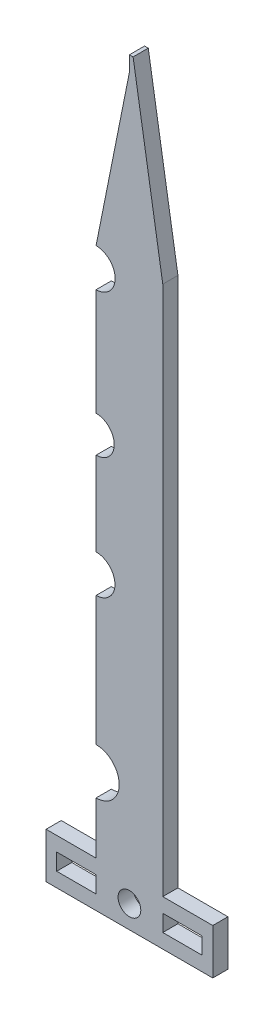
ISO-10303-21;
HEADER;
FILE_DESCRIPTION(('STEP AP214'),'2;1');
FILE_NAME('part.step','',(''),(''),'','','');
FILE_SCHEMA(('AUTOMOTIVE_DESIGN { 1 0 10303 214 1 1 1 1 }'));
ENDSEC;
DATA;
#1=APPLICATION_CONTEXT('core data for automotive mechanical design processes');
#2=APPLICATION_PROTOCOL_DEFINITION('international standard','automotive_design',2000,#1);
#3=PRODUCT_CONTEXT('',#1,'mechanical');
#4=PRODUCT('Part','Part','',(#3));
#5=PRODUCT_RELATED_PRODUCT_CATEGORY('part','',(#4));
#6=PRODUCT_DEFINITION_FORMATION('','',#4);
#7=PRODUCT_DEFINITION_CONTEXT('part definition',#1,'design');
#8=PRODUCT_DEFINITION('design','',#6,#7);
#9=PRODUCT_DEFINITION_SHAPE('','',#8);
#10=(LENGTH_UNIT() NAMED_UNIT(*) SI_UNIT(.MILLI.,.METRE.));
#11=(NAMED_UNIT(*) PLANE_ANGLE_UNIT() SI_UNIT($,.RADIAN.));
#12=(NAMED_UNIT(*) SI_UNIT($,.STERADIAN.) SOLID_ANGLE_UNIT());
#13=UNCERTAINTY_MEASURE_WITH_UNIT(LENGTH_MEASURE(1.E-05),#10,'distance_accuracy_value','');
#14=(GEOMETRIC_REPRESENTATION_CONTEXT(3) GLOBAL_UNCERTAINTY_ASSIGNED_CONTEXT((#13)) GLOBAL_UNIT_ASSIGNED_CONTEXT((#10,
#11,#12)) REPRESENTATION_CONTEXT('',''));
#15=CARTESIAN_POINT('',(0.,0.,0.));
#16=DIRECTION('',(0.,0.,1.));
#17=DIRECTION('',(1.,0.,0.));
#18=AXIS2_PLACEMENT_3D('',#15,#16,#17);
#19=CARTESIAN_POINT('',(-4.39999999998468,12.9314476149887,2.));
#20=DIRECTION('',(0.,0.,-1.));
#21=DIRECTION('',(-1.,0.,0.));
#22=AXIS2_PLACEMENT_3D('',#19,#20,#21);
#23=PLANE('',#22);
#24=DIRECTION('',(0.,-1.,0.));
#25=VECTOR('',#24,1.);
#26=CARTESIAN_POINT('',(4.4,1.1,2.));
#27=LINE('',#26,#25);
#28=CARTESIAN_POINT('',(4.4,1.1,2.));
#29=VERTEX_POINT('',#28);
#30=CARTESIAN_POINT('',(4.4,-1.1,2.));
#31=VERTEX_POINT('',#30);
#32=EDGE_CURVE('E244',#29,#31,#27,.T.);
#33=ORIENTED_EDGE('',*,*,#32,.F.);
#34=DIRECTION('',(-1.,0.,0.));
#35=VECTOR('',#34,1.);
#36=CARTESIAN_POINT('',(9.6,1.1,2.));
#37=LINE('',#36,#35);
#38=CARTESIAN_POINT('',(9.6,1.1,2.));
#39=VERTEX_POINT('',#38);
#40=EDGE_CURVE('E252',#39,#29,#37,.T.);
#41=ORIENTED_EDGE('',*,*,#40,.F.);
#42=DIRECTION('',(0.,1.,0.));
#43=VECTOR('',#42,1.);
#44=CARTESIAN_POINT('',(9.6,1.1,2.));
#45=LINE('',#44,#43);
#46=CARTESIAN_POINT('',(9.6,-1.1,2.));
#47=VERTEX_POINT('',#46);
#48=EDGE_CURVE('E249',#47,#39,#45,.T.);
#49=ORIENTED_EDGE('',*,*,#48,.F.);
#50=DIRECTION('',(1.,0.,0.));
#51=VECTOR('',#50,1.);
#52=CARTESIAN_POINT('',(9.6,-1.1,2.));
#53=LINE('',#52,#51);
#54=EDGE_CURVE('E246',#31,#47,#53,.T.);
#55=ORIENTED_EDGE('',*,*,#54,.F.);
#56=EDGE_LOOP('',(#33,#41,#49,#55));
#57=FACE_BOUND('',#56,.T.);
#58=DIRECTION('',(0.,1.,0.));
#59=VECTOR('',#58,1.);
#60=CARTESIAN_POINT('',(11.,3.,2.));
#61=LINE('',#60,#59);
#62=CARTESIAN_POINT('',(11.,-3.,2.));
#63=VERTEX_POINT('',#62);
#64=CARTESIAN_POINT('',(11.,3.,2.));
#65=VERTEX_POINT('',#64);
#66=EDGE_CURVE('E281',#63,#65,#61,.T.);
#67=ORIENTED_EDGE('',*,*,#66,.T.);
#68=DIRECTION('',(-1.,0.,0.));
#69=VECTOR('',#68,1.);
#70=CARTESIAN_POINT('',(4.4,3.,2.));
#71=LINE('',#70,#69);
#72=CARTESIAN_POINT('',(4.4,3.,2.));
#73=VERTEX_POINT('',#72);
#74=EDGE_CURVE('E284',#65,#73,#71,.T.);
#75=ORIENTED_EDGE('',*,*,#74,.T.);
#76=DIRECTION('',(0.,1.,0.));
#77=VECTOR('',#76,1.);
#78=CARTESIAN_POINT('',(4.39999999999998,72.9999999999821,2.));
#79=LINE('',#78,#77);
#80=CARTESIAN_POINT('',(4.39999999999998,72.9999999999821,2.));
#81=VERTEX_POINT('',#80);
#82=EDGE_CURVE('E287',#73,#81,#79,.T.);
#83=ORIENTED_EDGE('',*,*,#82,.T.);
#84=DIRECTION('',(-0.160841232854265,0.986980292515469,0.));
#85=VECTOR('',#84,1.);
#86=CARTESIAN_POINT('',(0.486767158779976,97.0130197074845,2.));
#87=LINE('',#86,#85);
#88=CARTESIAN_POINT('',(0.486767158779976,97.0130197074845,2.));
#89=VERTEX_POINT('',#88);
#90=EDGE_CURVE('E289',#81,#89,#87,.T.);
#91=ORIENTED_EDGE('',*,*,#90,.T.);
#92=DIRECTION('',(-1.,0.,0.));
#93=VECTOR('',#92,1.);
#94=CARTESIAN_POINT('',(0.,97.0130197074845,2.));
#95=LINE('',#94,#93);
#96=CARTESIAN_POINT('',(0.,97.0130197074845,2.));
#97=VERTEX_POINT('',#96);
#98=EDGE_CURVE('E291',#89,#97,#95,.T.);
#99=ORIENTED_EDGE('',*,*,#98,.T.);
#100=DIRECTION('',(0.,-1.,0.));
#101=VECTOR('',#100,1.);
#102=CARTESIAN_POINT('',(0.,97.0130197074845,2.));
#103=LINE('',#102,#101);
#104=CARTESIAN_POINT('',(0.,95.0130197074845,2.));
#105=VERTEX_POINT('',#104);
#106=EDGE_CURVE('E293',#97,#105,#103,.T.);
#107=ORIENTED_EDGE('',*,*,#106,.T.);
#108=DIRECTION('',(-0.19600459879337,-0.980602976362937,0.));
#109=VECTOR('',#108,1.);
#110=CARTESIAN_POINT('',(0.,95.0130197074845,2.));
#111=LINE('',#110,#109);
#112=CARTESIAN_POINT('',(-4.39999999999915,72.9999999999999,2.));
#113=VERTEX_POINT('',#112);
#114=EDGE_CURVE('E295',#105,#113,#111,.T.);
#115=ORIENTED_EDGE('',*,*,#114,.T.);
#116=CARTESIAN_POINT('',(-4.40000000000089,70.4831653604391,2.));
#117=DIRECTION('',(0.,0.,-1.));
#118=DIRECTION('',(-1.,0.,0.));
#119=AXIS2_PLACEMENT_3D('',#116,#117,#118);
#120=CIRCLE('',#119,2.51683463956072);
#121=CARTESIAN_POINT('',(-4.39999999999921,67.9663307208784,2.));
#122=VERTEX_POINT('',#121);
#123=EDGE_CURVE('E297',#113,#122,#120,.T.);
#124=ORIENTED_EDGE('',*,*,#123,.T.);
#125=DIRECTION('',(0.,-1.,0.));
#126=VECTOR('',#125,1.);
#127=CARTESIAN_POINT('',(-4.39999999999938,53.8485939816553,2.));
#128=LINE('',#127,#126);
#129=CARTESIAN_POINT('',(-4.39999999999938,53.8485939816553,2.));
#130=VERTEX_POINT('',#129);
#131=EDGE_CURVE('E299',#122,#130,#128,.T.);
#132=ORIENTED_EDGE('',*,*,#131,.T.);
#133=CARTESIAN_POINT('',(-4.39999999999942,51.4512477461011,2.));
#134=DIRECTION('',(0.,0.,-1.));
#135=DIRECTION('',(-1.,0.,0.));
#136=AXIS2_PLACEMENT_3D('',#133,#134,#135);
#137=CIRCLE('',#136,2.39734623555421);
#138=CARTESIAN_POINT('',(-4.39999999999944,49.0539015105469,2.));
#139=VERTEX_POINT('',#138);
#140=EDGE_CURVE('E301',#130,#139,#137,.T.);
#141=ORIENTED_EDGE('',*,*,#140,.T.);
#142=DIRECTION('',(0.,-1.,0.));
#143=VECTOR('',#142,1.);
#144=CARTESIAN_POINT('',(-4.39999999999958,37.9999999999999,2.));
#145=LINE('',#144,#143);
#146=CARTESIAN_POINT('',(-4.39999999999958,37.9999999999999,2.));
#147=VERTEX_POINT('',#146);
#148=EDGE_CURVE('E303',#139,#147,#145,.T.);
#149=ORIENTED_EDGE('',*,*,#148,.T.);
#150=CARTESIAN_POINT('',(-4.39999999999961,35.5129822568133,2.));
#151=DIRECTION('',(0.,0.,-1.));
#152=DIRECTION('',(-1.,0.,0.));
#153=AXIS2_PLACEMENT_3D('',#150,#151,#152);
#154=CIRCLE('',#153,2.48701774318666);
#155=CARTESIAN_POINT('',(-4.39999999999964,33.0259645136266,2.));
#156=VERTEX_POINT('',#155);
#157=EDGE_CURVE('E305',#147,#156,#154,.T.);
#158=ORIENTED_EDGE('',*,*,#157,.T.);
#159=DIRECTION('',(0.,-1.,0.));
#160=VECTOR('',#159,1.);
#161=CARTESIAN_POINT('',(-4.39999999999984,15.9828895361329,2.));
#162=LINE('',#161,#160);
#163=CARTESIAN_POINT('',(-4.39999999999984,15.9828895361329,2.));
#164=VERTEX_POINT('',#163);
#165=EDGE_CURVE('E307',#156,#164,#162,.T.);
#166=ORIENTED_EDGE('',*,*,#165,.T.);
#167=CARTESIAN_POINT('',(-4.39999999998468,12.9314476149887,2.));
#168=DIRECTION('',(0.,0.,-1.));
#169=DIRECTION('',(-1.,0.,0.));
#170=AXIS2_PLACEMENT_3D('',#167,#168,#169);
#171=CIRCLE('',#170,3.05144192114426);
#172=CARTESIAN_POINT('',(-4.39999999999992,9.8800056938444,2.));
#173=VERTEX_POINT('',#172);
#174=EDGE_CURVE('E309',#164,#173,#171,.T.);
#175=ORIENTED_EDGE('',*,*,#174,.T.);
#176=DIRECTION('',(0.,-1.,0.));
#177=VECTOR('',#176,1.);
#178=CARTESIAN_POINT('',(-4.4,3.,2.));
#179=LINE('',#178,#177);
#180=CARTESIAN_POINT('',(-4.4,3.,2.));
#181=VERTEX_POINT('',#180);
#182=EDGE_CURVE('E311',#173,#181,#179,.T.);
#183=ORIENTED_EDGE('',*,*,#182,.T.);
#184=DIRECTION('',(-1.,0.,0.));
#185=VECTOR('',#184,1.);
#186=CARTESIAN_POINT('',(-11.,3.,2.));
#187=LINE('',#186,#185);
#188=CARTESIAN_POINT('',(-11.,3.,2.));
#189=VERTEX_POINT('',#188);
#190=EDGE_CURVE('E313',#181,#189,#187,.T.);
#191=ORIENTED_EDGE('',*,*,#190,.T.);
#192=DIRECTION('',(0.,-1.,0.));
#193=VECTOR('',#192,1.);
#194=CARTESIAN_POINT('',(-11.,0.,2.));
#195=LINE('',#194,#193);
#196=CARTESIAN_POINT('',(-11.,-3.,2.));
#197=VERTEX_POINT('',#196);
#198=EDGE_CURVE('E315',#189,#197,#195,.T.);
#199=ORIENTED_EDGE('',*,*,#198,.T.);
#200=DIRECTION('',(1.,0.,0.));
#201=VECTOR('',#200,1.);
#202=CARTESIAN_POINT('',(-11.,-3.,2.));
#203=LINE('',#202,#201);
#204=EDGE_CURVE('E317',#197,#63,#203,.T.);
#205=ORIENTED_EDGE('',*,*,#204,.T.);
#206=EDGE_LOOP('',(#67,#75,#83,#91,#99,#107,#115,#124,#132,#141,#149,#158,#166,#175,#183,#191,
#199,#205));
#207=FACE_BOUND('',#206,.T.);
#208=CARTESIAN_POINT('',(0.,0.,2.));
#209=DIRECTION('',(0.,0.,1.));
#210=DIRECTION('',(1.,0.,0.));
#211=AXIS2_PLACEMENT_3D('',#208,#209,#210);
#212=CIRCLE('',#211,1.5);
#213=CARTESIAN_POINT('',(1.5,0.,2.));
#214=VERTEX_POINT('',#213);
#215=EDGE_CURVE('E275',#214,#214,#212,.T.);
#216=ORIENTED_EDGE('',*,*,#215,.F.);
#217=EDGE_LOOP('',(#216));
#218=FACE_BOUND('',#217,.T.);
#219=DIRECTION('',(0.,-1.,0.));
#220=VECTOR('',#219,1.);
#221=CARTESIAN_POINT('',(-9.6,1.1,2.));
#222=LINE('',#221,#220);
#223=CARTESIAN_POINT('',(-9.6,1.1,2.));
#224=VERTEX_POINT('',#223);
#225=CARTESIAN_POINT('',(-9.6,-1.1,2.));
#226=VERTEX_POINT('',#225);
#227=EDGE_CURVE('E208',#224,#226,#222,.T.);
#228=ORIENTED_EDGE('',*,*,#227,.F.);
#229=DIRECTION('',(-1.,0.,0.));
#230=VECTOR('',#229,1.);
#231=CARTESIAN_POINT('',(-9.6,1.1,2.));
#232=LINE('',#231,#230);
#233=CARTESIAN_POINT('',(-4.4,1.1,2.));
#234=VERTEX_POINT('',#233);
#235=EDGE_CURVE('E230',#234,#224,#232,.T.);
#236=ORIENTED_EDGE('',*,*,#235,.F.);
#237=DIRECTION('',(0.,1.,0.));
#238=VECTOR('',#237,1.);
#239=CARTESIAN_POINT('',(-4.4,1.1,2.));
#240=LINE('',#239,#238);
#241=CARTESIAN_POINT('',(-4.4,-1.1,2.));
#242=VERTEX_POINT('',#241);
#243=EDGE_CURVE('E228',#242,#234,#240,.T.);
#244=ORIENTED_EDGE('',*,*,#243,.F.);
#245=DIRECTION('',(1.,0.,0.));
#246=VECTOR('',#245,1.);
#247=CARTESIAN_POINT('',(-9.6,-1.1,2.));
#248=LINE('',#247,#246);
#249=EDGE_CURVE('E216',#226,#242,#248,.T.);
#250=ORIENTED_EDGE('',*,*,#249,.F.);
#251=EDGE_LOOP('',(#228,#236,#244,#250));
#252=FACE_BOUND('',#251,.T.);
#253=ADVANCED_FACE('F35',(#57,#207,#218,#252),#23,.F.);
#254=CARTESIAN_POINT('',(-4.39999999998468,12.9314476149887,0.));
#255=DIRECTION('',(0.,0.,-1.));
#256=DIRECTION('',(-1.,0.,0.));
#257=AXIS2_PLACEMENT_3D('',#254,#255,#256);
#258=PLANE('',#257);
#259=DIRECTION('',(-1.,0.,0.));
#260=VECTOR('',#259,1.);
#261=CARTESIAN_POINT('',(4.4,3.,0.));
#262=LINE('',#261,#260);
#263=CARTESIAN_POINT('',(11.,3.,0.));
#264=VERTEX_POINT('',#263);
#265=CARTESIAN_POINT('',(4.4,3.,0.));
#266=VERTEX_POINT('',#265);
#267=EDGE_CURVE('E278',#264,#266,#262,.T.);
#268=ORIENTED_EDGE('',*,*,#267,.F.);
#269=DIRECTION('',(0.,1.,0.));
#270=VECTOR('',#269,1.);
#271=CARTESIAN_POINT('',(11.,0.,0.));
#272=LINE('',#271,#270);
#273=CARTESIAN_POINT('',(11.,-3.,0.));
#274=VERTEX_POINT('',#273);
#275=EDGE_CURVE('E285',#274,#264,#272,.T.);
#276=ORIENTED_EDGE('',*,*,#275,.F.);
#277=DIRECTION('',(1.,0.,0.));
#278=VECTOR('',#277,1.);
#279=CARTESIAN_POINT('',(-11.,-3.,0.));
#280=LINE('',#279,#278);
#281=CARTESIAN_POINT('',(-11.,-3.,0.));
#282=VERTEX_POINT('',#281);
#283=EDGE_CURVE('E353',#282,#274,#280,.T.);
#284=ORIENTED_EDGE('',*,*,#283,.F.);
#285=DIRECTION('',(0.,-1.,0.));
#286=VECTOR('',#285,1.);
#287=CARTESIAN_POINT('',(-11.,0.,0.));
#288=LINE('',#287,#286);
#289=CARTESIAN_POINT('',(-11.,3.,0.));
#290=VERTEX_POINT('',#289);
#291=EDGE_CURVE('E351',#290,#282,#288,.T.);
#292=ORIENTED_EDGE('',*,*,#291,.F.);
#293=DIRECTION('',(-1.,0.,0.));
#294=VECTOR('',#293,1.);
#295=CARTESIAN_POINT('',(-11.,3.,0.));
#296=LINE('',#295,#294);
#297=CARTESIAN_POINT('',(-4.4,3.,0.));
#298=VERTEX_POINT('',#297);
#299=EDGE_CURVE('E348',#298,#290,#296,.T.);
#300=ORIENTED_EDGE('',*,*,#299,.F.);
#301=DIRECTION('',(0.,-1.,0.));
#302=VECTOR('',#301,1.);
#303=CARTESIAN_POINT('',(-4.4,3.,0.));
#304=LINE('',#303,#302);
#305=CARTESIAN_POINT('',(-4.39999999999992,9.8800056938444,0.));
#306=VERTEX_POINT('',#305);
#307=EDGE_CURVE('E346',#306,#298,#304,.T.);
#308=ORIENTED_EDGE('',*,*,#307,.F.);
#309=CARTESIAN_POINT('',(-4.39999999998468,12.9314476149887,0.));
#310=DIRECTION('',(0.,0.,-1.));
#311=DIRECTION('',(-1.,0.,0.));
#312=AXIS2_PLACEMENT_3D('',#309,#310,#311);
#313=CIRCLE('',#312,3.05144192114426);
#314=CARTESIAN_POINT('',(-4.39999999999984,15.9828895361329,0.));
#315=VERTEX_POINT('',#314);
#316=EDGE_CURVE('E344',#315,#306,#313,.T.);
#317=ORIENTED_EDGE('',*,*,#316,.F.);
#318=DIRECTION('',(0.,-1.,0.));
#319=VECTOR('',#318,1.);
#320=CARTESIAN_POINT('',(-4.39999999999984,15.9828895361329,0.));
#321=LINE('',#320,#319);
#322=CARTESIAN_POINT('',(-4.39999999999964,33.0259645136266,0.));
#323=VERTEX_POINT('',#322);
#324=EDGE_CURVE('E342',#323,#315,#321,.T.);
#325=ORIENTED_EDGE('',*,*,#324,.F.);
#326=CARTESIAN_POINT('',(-4.39999999999961,35.5129822568133,0.));
#327=DIRECTION('',(0.,0.,-1.));
#328=DIRECTION('',(-1.,0.,0.));
#329=AXIS2_PLACEMENT_3D('',#326,#327,#328);
#330=CIRCLE('',#329,2.48701774318666);
#331=CARTESIAN_POINT('',(-4.39999999999958,37.9999999999999,0.));
#332=VERTEX_POINT('',#331);
#333=EDGE_CURVE('E340',#332,#323,#330,.T.);
#334=ORIENTED_EDGE('',*,*,#333,.F.);
#335=DIRECTION('',(0.,-1.,0.));
#336=VECTOR('',#335,1.);
#337=CARTESIAN_POINT('',(-4.39999999999958,37.9999999999999,0.));
#338=LINE('',#337,#336);
#339=CARTESIAN_POINT('',(-4.39999999999944,49.0539015105469,0.));
#340=VERTEX_POINT('',#339);
#341=EDGE_CURVE('E338',#340,#332,#338,.T.);
#342=ORIENTED_EDGE('',*,*,#341,.F.);
#343=CARTESIAN_POINT('',(-4.39999999999942,51.4512477461011,0.));
#344=DIRECTION('',(0.,0.,-1.));
#345=DIRECTION('',(-1.,0.,0.));
#346=AXIS2_PLACEMENT_3D('',#343,#344,#345);
#347=CIRCLE('',#346,2.39734623555421);
#348=CARTESIAN_POINT('',(-4.39999999999938,53.8485939816553,0.));
#349=VERTEX_POINT('',#348);
#350=EDGE_CURVE('E336',#349,#340,#347,.T.);
#351=ORIENTED_EDGE('',*,*,#350,.F.);
#352=DIRECTION('',(0.,-1.,0.));
#353=VECTOR('',#352,1.);
#354=CARTESIAN_POINT('',(-4.39999999999938,53.8485939816553,0.));
#355=LINE('',#354,#353);
#356=CARTESIAN_POINT('',(-4.39999999999921,67.9663307208784,0.));
#357=VERTEX_POINT('',#356);
#358=EDGE_CURVE('E334',#357,#349,#355,.T.);
#359=ORIENTED_EDGE('',*,*,#358,.F.);
#360=CARTESIAN_POINT('',(-4.40000000000089,70.4831653604391,0.));
#361=DIRECTION('',(0.,0.,-1.));
#362=DIRECTION('',(-1.,0.,0.));
#363=AXIS2_PLACEMENT_3D('',#360,#361,#362);
#364=CIRCLE('',#363,2.51683463956072);
#365=CARTESIAN_POINT('',(-4.39999999999915,72.9999999999999,0.));
#366=VERTEX_POINT('',#365);
#367=EDGE_CURVE('E332',#366,#357,#364,.T.);
#368=ORIENTED_EDGE('',*,*,#367,.F.);
#369=DIRECTION('',(-0.19600459879337,-0.980602976362937,0.));
#370=VECTOR('',#369,1.);
#371=CARTESIAN_POINT('',(0.,95.0130197074845,0.));
#372=LINE('',#371,#370);
#373=CARTESIAN_POINT('',(0.,95.0130197074845,0.));
#374=VERTEX_POINT('',#373);
#375=EDGE_CURVE('E330',#374,#366,#372,.T.);
#376=ORIENTED_EDGE('',*,*,#375,.F.);
#377=DIRECTION('',(0.,-1.,0.));
#378=VECTOR('',#377,1.);
#379=CARTESIAN_POINT('',(0.,97.0130197074845,0.));
#380=LINE('',#379,#378);
#381=CARTESIAN_POINT('',(0.,97.0130197074845,0.));
#382=VERTEX_POINT('',#381);
#383=EDGE_CURVE('E328',#382,#374,#380,.T.);
#384=ORIENTED_EDGE('',*,*,#383,.F.);
#385=DIRECTION('',(-1.,0.,0.));
#386=VECTOR('',#385,1.);
#387=CARTESIAN_POINT('',(0.,97.0130197074845,0.));
#388=LINE('',#387,#386);
#389=CARTESIAN_POINT('',(0.486767158779976,97.0130197074845,0.));
#390=VERTEX_POINT('',#389);
#391=EDGE_CURVE('E326',#390,#382,#388,.T.);
#392=ORIENTED_EDGE('',*,*,#391,.F.);
#393=DIRECTION('',(-0.160841232854265,0.986980292515469,0.));
#394=VECTOR('',#393,1.);
#395=CARTESIAN_POINT('',(0.486767158779976,97.0130197074845,0.));
#396=LINE('',#395,#394);
#397=CARTESIAN_POINT('',(4.39999999999998,72.9999999999821,0.));
#398=VERTEX_POINT('',#397);
#399=EDGE_CURVE('E324',#398,#390,#396,.T.);
#400=ORIENTED_EDGE('',*,*,#399,.F.);
#401=DIRECTION('',(0.,1.,0.));
#402=VECTOR('',#401,1.);
#403=CARTESIAN_POINT('',(4.39999999999998,72.9999999999821,0.));
#404=LINE('',#403,#402);
#405=EDGE_CURVE('E322',#266,#398,#404,.T.);
#406=ORIENTED_EDGE('',*,*,#405,.F.);
#407=EDGE_LOOP('',(#268,#276,#284,#292,#300,#308,#317,#325,#334,#342,#351,#359,#368,#376,#384,
#392,#400,#406));
#408=FACE_BOUND('',#407,.T.);
#409=CARTESIAN_POINT('',(0.,0.,0.));
#410=DIRECTION('',(0.,0.,1.));
#411=DIRECTION('',(1.,0.,0.));
#412=AXIS2_PLACEMENT_3D('',#409,#410,#411);
#413=CIRCLE('',#412,1.5);
#414=CARTESIAN_POINT('',(1.5,0.,0.));
#415=VERTEX_POINT('',#414);
#416=EDGE_CURVE('E274',#415,#415,#413,.T.);
#417=ORIENTED_EDGE('',*,*,#416,.T.);
#418=EDGE_LOOP('',(#417));
#419=FACE_BOUND('',#418,.T.);
#420=DIRECTION('',(-1.,0.,0.));
#421=VECTOR('',#420,1.);
#422=CARTESIAN_POINT('',(9.6,1.1,0.));
#423=LINE('',#422,#421);
#424=CARTESIAN_POINT('',(9.6,1.1,0.));
#425=VERTEX_POINT('',#424);
#426=CARTESIAN_POINT('',(4.4,1.1,0.));
#427=VERTEX_POINT('',#426);
#428=EDGE_CURVE('E247',#425,#427,#423,.T.);
#429=ORIENTED_EDGE('',*,*,#428,.T.);
#430=DIRECTION('',(0.,-1.,0.));
#431=VECTOR('',#430,1.);
#432=CARTESIAN_POINT('',(4.4,1.1,0.));
#433=LINE('',#432,#431);
#434=CARTESIAN_POINT('',(4.4,-1.1,0.));
#435=VERTEX_POINT('',#434);
#436=EDGE_CURVE('E224',#427,#435,#433,.T.);
#437=ORIENTED_EDGE('',*,*,#436,.T.);
#438=DIRECTION('',(1.,0.,0.));
#439=VECTOR('',#438,1.);
#440=CARTESIAN_POINT('',(9.6,-1.1,0.));
#441=LINE('',#440,#439);
#442=CARTESIAN_POINT('',(9.6,-1.1,0.));
#443=VERTEX_POINT('',#442);
#444=EDGE_CURVE('E257',#435,#443,#441,.T.);
#445=ORIENTED_EDGE('',*,*,#444,.T.);
#446=DIRECTION('',(0.,1.,0.));
#447=VECTOR('',#446,1.);
#448=CARTESIAN_POINT('',(9.6,1.1,0.));
#449=LINE('',#448,#447);
#450=EDGE_CURVE('E260',#443,#425,#449,.T.);
#451=ORIENTED_EDGE('',*,*,#450,.T.);
#452=EDGE_LOOP('',(#429,#437,#445,#451));
#453=FACE_BOUND('',#452,.T.);
#454=DIRECTION('',(-1.,0.,0.));
#455=VECTOR('',#454,1.);
#456=CARTESIAN_POINT('',(-9.6,1.1,0.));
#457=LINE('',#456,#455);
#458=CARTESIAN_POINT('',(-4.4,1.1,0.));
#459=VERTEX_POINT('',#458);
#460=CARTESIAN_POINT('',(-9.6,1.1,0.));
#461=VERTEX_POINT('',#460);
#462=EDGE_CURVE('E217',#459,#461,#457,.T.);
#463=ORIENTED_EDGE('',*,*,#462,.T.);
#464=DIRECTION('',(0.,-1.,0.));
#465=VECTOR('',#464,1.);
#466=CARTESIAN_POINT('',(-9.6,1.1,0.));
#467=LINE('',#466,#465);
#468=CARTESIAN_POINT('',(-9.6,-1.1,0.));
#469=VERTEX_POINT('',#468);
#470=EDGE_CURVE('E58',#461,#469,#467,.T.);
#471=ORIENTED_EDGE('',*,*,#470,.T.);
#472=DIRECTION('',(1.,0.,0.));
#473=VECTOR('',#472,1.);
#474=CARTESIAN_POINT('',(-9.6,-1.1,0.));
#475=LINE('',#474,#473);
#476=CARTESIAN_POINT('',(-4.4,-1.1,0.));
#477=VERTEX_POINT('',#476);
#478=EDGE_CURVE('E223',#469,#477,#475,.T.);
#479=ORIENTED_EDGE('',*,*,#478,.T.);
#480=DIRECTION('',(0.,1.,0.));
#481=VECTOR('',#480,1.);
#482=CARTESIAN_POINT('',(-4.4,1.1,0.));
#483=LINE('',#482,#481);
#484=EDGE_CURVE('E236',#477,#459,#483,.T.);
#485=ORIENTED_EDGE('',*,*,#484,.T.);
#486=EDGE_LOOP('',(#463,#471,#479,#485));
#487=FACE_BOUND('',#486,.T.);
#488=ADVANCED_FACE('F413',(#408,#419,#453,#487),#258,.T.);
#489=CARTESIAN_POINT('',(4.4,3.,2.));
#490=DIRECTION('',(0.,-1.,0.));
#491=DIRECTION('',(0.,0.,-1.));
#492=AXIS2_PLACEMENT_3D('',#489,#490,#491);
#493=PLANE('',#492);
#494=ORIENTED_EDGE('',*,*,#267,.T.);
#495=DIRECTION('',(0.,0.,-1.));
#496=VECTOR('',#495,1.);
#497=CARTESIAN_POINT('',(4.4,3.,2.));
#498=LINE('',#497,#496);
#499=EDGE_CURVE('E43',#73,#266,#498,.T.);
#500=ORIENTED_EDGE('',*,*,#499,.F.);
#501=ORIENTED_EDGE('',*,*,#74,.F.);
#502=DIRECTION('',(0.,0.,-1.));
#503=VECTOR('',#502,1.);
#504=CARTESIAN_POINT('',(11.,3.,2.));
#505=LINE('',#504,#503);
#506=EDGE_CURVE('E11',#65,#264,#505,.T.);
#507=ORIENTED_EDGE('',*,*,#506,.T.);
#508=EDGE_LOOP('',(#494,#500,#501,#507));
#509=FACE_BOUND('',#508,.T.);
#510=ADVANCED_FACE('F37',(#509),#493,.F.);
#511=CARTESIAN_POINT('',(4.39999999999998,72.9999999999821,2.));
#512=DIRECTION('',(-1.,0.,0.));
#513=DIRECTION('',(0.,-1.,0.));
#514=AXIS2_PLACEMENT_3D('',#511,#512,#513);
#515=PLANE('',#514);
#516=ORIENTED_EDGE('',*,*,#405,.T.);
#517=DIRECTION('',(0.,0.,-1.));
#518=VECTOR('',#517,1.);
#519=CARTESIAN_POINT('',(4.39999999999998,72.9999999999821,2.));
#520=LINE('',#519,#518);
#521=EDGE_CURVE('E400',#81,#398,#520,.T.);
#522=ORIENTED_EDGE('',*,*,#521,.F.);
#523=ORIENTED_EDGE('',*,*,#82,.F.);
#524=ORIENTED_EDGE('',*,*,#499,.T.);
#525=EDGE_LOOP('',(#516,#522,#523,#524));
#526=FACE_BOUND('',#525,.T.);
#527=ADVANCED_FACE('F407',(#526),#515,.F.);
#528=CARTESIAN_POINT('',(0.486767158779976,97.0130197074845,2.));
#529=DIRECTION('',(-0.986980292515469,-0.160841232854265,0.));
#530=DIRECTION('',(0.160841232854265,-0.986980292515469,0.));
#531=AXIS2_PLACEMENT_3D('',#528,#529,#530);
#532=PLANE('',#531);
#533=ORIENTED_EDGE('',*,*,#399,.T.);
#534=DIRECTION('',(0.,0.,-1.));
#535=VECTOR('',#534,1.);
#536=CARTESIAN_POINT('',(0.486767158779976,97.0130197074845,2.));
#537=LINE('',#536,#535);
#538=EDGE_CURVE('E397',#89,#390,#537,.T.);
#539=ORIENTED_EDGE('',*,*,#538,.F.);
#540=ORIENTED_EDGE('',*,*,#90,.F.);
#541=ORIENTED_EDGE('',*,*,#521,.T.);
#542=EDGE_LOOP('',(#533,#539,#540,#541));
#543=FACE_BOUND('',#542,.T.);
#544=ADVANCED_FACE('F420',(#543),#532,.F.);
#545=CARTESIAN_POINT('',(0.,97.0130197074845,2.));
#546=DIRECTION('',(0.,-1.,0.));
#547=DIRECTION('',(1.,0.,0.));
#548=AXIS2_PLACEMENT_3D('',#545,#546,#547);
#549=PLANE('',#548);
#550=ORIENTED_EDGE('',*,*,#391,.T.);
#551=DIRECTION('',(0.,0.,-1.));
#552=VECTOR('',#551,1.);
#553=CARTESIAN_POINT('',(0.,97.0130197074845,2.));
#554=LINE('',#553,#552);
#555=EDGE_CURVE('E394',#97,#382,#554,.T.);
#556=ORIENTED_EDGE('',*,*,#555,.F.);
#557=ORIENTED_EDGE('',*,*,#98,.F.);
#558=ORIENTED_EDGE('',*,*,#538,.T.);
#559=EDGE_LOOP('',(#550,#556,#557,#558));
#560=FACE_BOUND('',#559,.T.);
#561=ADVANCED_FACE('F424',(#560),#549,.F.);
#562=CARTESIAN_POINT('',(0.,97.0130197074845,2.));
#563=DIRECTION('',(1.,0.,0.));
#564=DIRECTION('',(0.,1.,0.));
#565=AXIS2_PLACEMENT_3D('',#562,#563,#564);
#566=PLANE('',#565);
#567=ORIENTED_EDGE('',*,*,#383,.T.);
#568=DIRECTION('',(0.,0.,-1.));
#569=VECTOR('',#568,1.);
#570=CARTESIAN_POINT('',(0.,95.0130197074845,2.));
#571=LINE('',#570,#569);
#572=EDGE_CURVE('E391',#105,#374,#571,.T.);
#573=ORIENTED_EDGE('',*,*,#572,.F.);
#574=ORIENTED_EDGE('',*,*,#106,.F.);
#575=ORIENTED_EDGE('',*,*,#555,.T.);
#576=EDGE_LOOP('',(#567,#573,#574,#575));
#577=FACE_BOUND('',#576,.T.);
#578=ADVANCED_FACE('F493',(#577),#566,.F.);
#579=CARTESIAN_POINT('',(0.,95.0130197074845,2.));
#580=DIRECTION('',(0.980602976362937,-0.19600459879337,0.));
#581=DIRECTION('',(0.19600459879337,0.980602976362937,0.));
#582=AXIS2_PLACEMENT_3D('',#579,#580,#581);
#583=PLANE('',#582);
#584=ORIENTED_EDGE('',*,*,#375,.T.);
#585=DIRECTION('',(0.,0.,-1.));
#586=VECTOR('',#585,1.);
#587=CARTESIAN_POINT('',(-4.39999999999915,72.9999999999999,2.));
#588=LINE('',#587,#586);
#589=EDGE_CURVE('E388',#113,#366,#588,.T.);
#590=ORIENTED_EDGE('',*,*,#589,.F.);
#591=ORIENTED_EDGE('',*,*,#114,.F.);
#592=ORIENTED_EDGE('',*,*,#572,.T.);
#593=EDGE_LOOP('',(#584,#590,#591,#592));
#594=FACE_BOUND('',#593,.T.);
#595=ADVANCED_FACE('F491',(#594),#583,.F.);
#596=CARTESIAN_POINT('',(-4.40000000000089,70.4831653604391,2.));
#597=DIRECTION('',(0.,0.,-1.));
#598=DIRECTION('',(-1.,0.,0.));
#599=AXIS2_PLACEMENT_3D('',#596,#597,#598);
#600=CYLINDRICAL_SURFACE('',#599,2.51683463956072);
#601=ORIENTED_EDGE('',*,*,#367,.T.);
#602=DIRECTION('',(0.,0.,-1.));
#603=VECTOR('',#602,1.);
#604=CARTESIAN_POINT('',(-4.39999999999921,67.9663307208784,2.));
#605=LINE('',#604,#603);
#606=EDGE_CURVE('E385',#122,#357,#605,.T.);
#607=ORIENTED_EDGE('',*,*,#606,.F.);
#608=ORIENTED_EDGE('',*,*,#123,.F.);
#609=ORIENTED_EDGE('',*,*,#589,.T.);
#610=EDGE_LOOP('',(#601,#607,#608,#609));
#611=FACE_BOUND('',#610,.T.);
#612=ADVANCED_FACE('F487',(#611),#600,.F.);
#613=CARTESIAN_POINT('',(-4.39999999999938,53.8485939816553,2.));
#614=DIRECTION('',(1.,0.,0.));
#615=DIRECTION('',(0.,1.,0.));
#616=AXIS2_PLACEMENT_3D('',#613,#614,#615);
#617=PLANE('',#616);
#618=ORIENTED_EDGE('',*,*,#358,.T.);
#619=DIRECTION('',(0.,0.,-1.));
#620=VECTOR('',#619,1.);
#621=CARTESIAN_POINT('',(-4.39999999999938,53.8485939816553,2.));
#622=LINE('',#621,#620);
#623=EDGE_CURVE('E382',#130,#349,#622,.T.);
#624=ORIENTED_EDGE('',*,*,#623,.F.);
#625=ORIENTED_EDGE('',*,*,#131,.F.);
#626=ORIENTED_EDGE('',*,*,#606,.T.);
#627=EDGE_LOOP('',(#618,#624,#625,#626));
#628=FACE_BOUND('',#627,.T.);
#629=ADVANCED_FACE('F482',(#628),#617,.F.);
#630=CARTESIAN_POINT('',(-4.39999999999942,51.4512477461011,2.));
#631=DIRECTION('',(0.,0.,-1.));
#632=DIRECTION('',(-1.,0.,0.));
#633=AXIS2_PLACEMENT_3D('',#630,#631,#632);
#634=CYLINDRICAL_SURFACE('',#633,2.39734623555421);
#635=ORIENTED_EDGE('',*,*,#350,.T.);
#636=DIRECTION('',(0.,0.,-1.));
#637=VECTOR('',#636,1.);
#638=CARTESIAN_POINT('',(-4.39999999999944,49.0539015105469,2.));
#639=LINE('',#638,#637);
#640=EDGE_CURVE('E379',#139,#340,#639,.T.);
#641=ORIENTED_EDGE('',*,*,#640,.F.);
#642=ORIENTED_EDGE('',*,*,#140,.F.);
#643=ORIENTED_EDGE('',*,*,#623,.T.);
#644=EDGE_LOOP('',(#635,#641,#642,#643));
#645=FACE_BOUND('',#644,.T.);
#646=ADVANCED_FACE('F476',(#645),#634,.F.);
#647=CARTESIAN_POINT('',(-4.39999999999958,37.9999999999999,2.));
#648=DIRECTION('',(1.,0.,0.));
#649=DIRECTION('',(0.,1.,0.));
#650=AXIS2_PLACEMENT_3D('',#647,#648,#649);
#651=PLANE('',#650);
#652=ORIENTED_EDGE('',*,*,#341,.T.);
#653=DIRECTION('',(0.,0.,-1.));
#654=VECTOR('',#653,1.);
#655=CARTESIAN_POINT('',(-4.39999999999958,37.9999999999999,2.));
#656=LINE('',#655,#654);
#657=EDGE_CURVE('E376',#147,#332,#656,.T.);
#658=ORIENTED_EDGE('',*,*,#657,.F.);
#659=ORIENTED_EDGE('',*,*,#148,.F.);
#660=ORIENTED_EDGE('',*,*,#640,.T.);
#661=EDGE_LOOP('',(#652,#658,#659,#660));
#662=FACE_BOUND('',#661,.T.);
#663=ADVANCED_FACE('F472',(#662),#651,.F.);
#664=CARTESIAN_POINT('',(-4.39999999999961,35.5129822568133,2.));
#665=DIRECTION('',(0.,0.,-1.));
#666=DIRECTION('',(-1.,0.,0.));
#667=AXIS2_PLACEMENT_3D('',#664,#665,#666);
#668=CYLINDRICAL_SURFACE('',#667,2.48701774318666);
#669=ORIENTED_EDGE('',*,*,#333,.T.);
#670=DIRECTION('',(0.,0.,-1.));
#671=VECTOR('',#670,1.);
#672=CARTESIAN_POINT('',(-4.39999999999964,33.0259645136266,2.));
#673=LINE('',#672,#671);
#674=EDGE_CURVE('E373',#156,#323,#673,.T.);
#675=ORIENTED_EDGE('',*,*,#674,.F.);
#676=ORIENTED_EDGE('',*,*,#157,.F.);
#677=ORIENTED_EDGE('',*,*,#657,.T.);
#678=EDGE_LOOP('',(#669,#675,#676,#677));
#679=FACE_BOUND('',#678,.T.);
#680=ADVANCED_FACE('F467',(#679),#668,.F.);
#681=CARTESIAN_POINT('',(-4.39999999999984,15.9828895361329,2.));
#682=DIRECTION('',(1.,0.,0.));
#683=DIRECTION('',(0.,1.,0.));
#684=AXIS2_PLACEMENT_3D('',#681,#682,#683);
#685=PLANE('',#684);
#686=ORIENTED_EDGE('',*,*,#324,.T.);
#687=DIRECTION('',(0.,0.,-1.));
#688=VECTOR('',#687,1.);
#689=CARTESIAN_POINT('',(-4.39999999999984,15.9828895361329,2.));
#690=LINE('',#689,#688);
#691=EDGE_CURVE('E370',#164,#315,#690,.T.);
#692=ORIENTED_EDGE('',*,*,#691,.F.);
#693=ORIENTED_EDGE('',*,*,#165,.F.);
#694=ORIENTED_EDGE('',*,*,#674,.T.);
#695=EDGE_LOOP('',(#686,#692,#693,#694));
#696=FACE_BOUND('',#695,.T.);
#697=ADVANCED_FACE('F461',(#696),#685,.F.);
#698=CARTESIAN_POINT('',(-4.39999999998468,12.9314476149887,2.));
#699=DIRECTION('',(0.,0.,-1.));
#700=DIRECTION('',(-1.,0.,0.));
#701=AXIS2_PLACEMENT_3D('',#698,#699,#700);
#702=CYLINDRICAL_SURFACE('',#701,3.05144192114426);
#703=ORIENTED_EDGE('',*,*,#316,.T.);
#704=DIRECTION('',(0.,0.,-1.));
#705=VECTOR('',#704,1.);
#706=CARTESIAN_POINT('',(-4.39999999999992,9.8800056938444,2.));
#707=LINE('',#706,#705);
#708=EDGE_CURVE('E367',#173,#306,#707,.T.);
#709=ORIENTED_EDGE('',*,*,#708,.F.);
#710=ORIENTED_EDGE('',*,*,#174,.F.);
#711=ORIENTED_EDGE('',*,*,#691,.T.);
#712=EDGE_LOOP('',(#703,#709,#710,#711));
#713=FACE_BOUND('',#712,.T.);
#714=ADVANCED_FACE('F457',(#713),#702,.F.);
#715=CARTESIAN_POINT('',(-4.4,3.,2.));
#716=DIRECTION('',(1.,0.,0.));
#717=DIRECTION('',(0.,1.,0.));
#718=AXIS2_PLACEMENT_3D('',#715,#716,#717);
#719=PLANE('',#718);
#720=ORIENTED_EDGE('',*,*,#307,.T.);
#721=DIRECTION('',(0.,0.,-1.));
#722=VECTOR('',#721,1.);
#723=CARTESIAN_POINT('',(-4.4,3.,2.));
#724=LINE('',#723,#722);
#725=EDGE_CURVE('E364',#181,#298,#724,.T.);
#726=ORIENTED_EDGE('',*,*,#725,.F.);
#727=ORIENTED_EDGE('',*,*,#182,.F.);
#728=ORIENTED_EDGE('',*,*,#708,.T.);
#729=EDGE_LOOP('',(#720,#726,#727,#728));
#730=FACE_BOUND('',#729,.T.);
#731=ADVANCED_FACE('F452',(#730),#719,.F.);
#732=CARTESIAN_POINT('',(-11.,3.,2.));
#733=DIRECTION('',(0.,-1.,0.));
#734=DIRECTION('',(0.,0.,-1.));
#735=AXIS2_PLACEMENT_3D('',#732,#733,#734);
#736=PLANE('',#735);
#737=ORIENTED_EDGE('',*,*,#299,.T.);
#738=DIRECTION('',(0.,0.,-1.));
#739=VECTOR('',#738,1.);
#740=CARTESIAN_POINT('',(-11.,3.,2.));
#741=LINE('',#740,#739);
#742=EDGE_CURVE('E361',#189,#290,#741,.T.);
#743=ORIENTED_EDGE('',*,*,#742,.F.);
#744=ORIENTED_EDGE('',*,*,#190,.F.);
#745=ORIENTED_EDGE('',*,*,#725,.T.);
#746=EDGE_LOOP('',(#737,#743,#744,#745));
#747=FACE_BOUND('',#746,.T.);
#748=ADVANCED_FACE('F446',(#747),#736,.F.);
#749=CARTESIAN_POINT('',(-11.,0.,2.));
#750=DIRECTION('',(1.,0.,0.));
#751=DIRECTION('',(0.,0.,-1.));
#752=AXIS2_PLACEMENT_3D('',#749,#750,#751);
#753=PLANE('',#752);
#754=ORIENTED_EDGE('',*,*,#291,.T.);
#755=DIRECTION('',(0.,0.,-1.));
#756=VECTOR('',#755,1.);
#757=CARTESIAN_POINT('',(-11.,-3.,2.));
#758=LINE('',#757,#756);
#759=EDGE_CURVE('E358',#197,#282,#758,.T.);
#760=ORIENTED_EDGE('',*,*,#759,.F.);
#761=ORIENTED_EDGE('',*,*,#198,.F.);
#762=ORIENTED_EDGE('',*,*,#742,.T.);
#763=EDGE_LOOP('',(#754,#760,#761,#762));
#764=FACE_BOUND('',#763,.T.);
#765=ADVANCED_FACE('F442',(#764),#753,.F.);
#766=CARTESIAN_POINT('',(-11.,-3.,2.));
#767=DIRECTION('',(0.,1.,0.));
#768=DIRECTION('',(0.,0.,1.));
#769=AXIS2_PLACEMENT_3D('',#766,#767,#768);
#770=PLANE('',#769);
#771=ORIENTED_EDGE('',*,*,#283,.T.);
#772=DIRECTION('',(0.,0.,-1.));
#773=VECTOR('',#772,1.);
#774=CARTESIAN_POINT('',(11.,-3.,2.));
#775=LINE('',#774,#773);
#776=EDGE_CURVE('E320',#63,#274,#775,.T.);
#777=ORIENTED_EDGE('',*,*,#776,.F.);
#778=ORIENTED_EDGE('',*,*,#204,.F.);
#779=ORIENTED_EDGE('',*,*,#759,.T.);
#780=EDGE_LOOP('',(#771,#777,#778,#779));
#781=FACE_BOUND('',#780,.T.);
#782=ADVANCED_FACE('F437',(#781),#770,.F.);
#783=CARTESIAN_POINT('',(11.,0.,2.));
#784=DIRECTION('',(-1.,0.,0.));
#785=DIRECTION('',(0.,0.,1.));
#786=AXIS2_PLACEMENT_3D('',#783,#784,#785);
#787=PLANE('',#786);
#788=ORIENTED_EDGE('',*,*,#275,.T.);
#789=ORIENTED_EDGE('',*,*,#506,.F.);
#790=ORIENTED_EDGE('',*,*,#66,.F.);
#791=ORIENTED_EDGE('',*,*,#776,.T.);
#792=EDGE_LOOP('',(#788,#789,#790,#791));
#793=FACE_BOUND('',#792,.T.);
#794=ADVANCED_FACE('F432',(#793),#787,.F.);
#795=CARTESIAN_POINT('',(0.,0.,2.));
#796=DIRECTION('',(0.,0.,-1.));
#797=DIRECTION('',(-1.,0.,0.));
#798=AXIS2_PLACEMENT_3D('',#795,#796,#797);
#799=CYLINDRICAL_SURFACE('',#798,1.5);
#800=ORIENTED_EDGE('',*,*,#215,.T.);
#801=EDGE_LOOP('',(#800));
#802=FACE_BOUND('',#801,.T.);
#803=ORIENTED_EDGE('',*,*,#416,.F.);
#804=EDGE_LOOP('',(#803));
#805=FACE_BOUND('',#804,.T.);
#806=ADVANCED_FACE('F511',(#802,#805),#799,.F.);
#807=CARTESIAN_POINT('',(4.4,1.1,2.));
#808=DIRECTION('',(1.,0.,0.));
#809=DIRECTION('',(0.,0.,-1.));
#810=AXIS2_PLACEMENT_3D('',#807,#808,#809);
#811=PLANE('',#810);
#812=ORIENTED_EDGE('',*,*,#436,.F.);
#813=DIRECTION('',(0.,0.,-1.));
#814=VECTOR('',#813,1.);
#815=CARTESIAN_POINT('',(4.4,1.1,2.));
#816=LINE('',#815,#814);
#817=EDGE_CURVE('E254',#29,#427,#816,.T.);
#818=ORIENTED_EDGE('',*,*,#817,.F.);
#819=ORIENTED_EDGE('',*,*,#32,.T.);
#820=DIRECTION('',(0.,0.,-1.));
#821=VECTOR('',#820,1.);
#822=CARTESIAN_POINT('',(4.4,-1.1,2.));
#823=LINE('',#822,#821);
#824=EDGE_CURVE('E271',#31,#435,#823,.T.);
#825=ORIENTED_EDGE('',*,*,#824,.T.);
#826=EDGE_LOOP('',(#812,#818,#819,#825));
#827=FACE_BOUND('',#826,.T.);
#828=ADVANCED_FACE('F591',(#827),#811,.T.);
#829=CARTESIAN_POINT('',(9.6,-1.1,2.));
#830=DIRECTION('',(0.,1.,0.));
#831=DIRECTION('',(-1.,0.,0.));
#832=AXIS2_PLACEMENT_3D('',#829,#830,#831);
#833=PLANE('',#832);
#834=ORIENTED_EDGE('',*,*,#444,.F.);
#835=ORIENTED_EDGE('',*,*,#824,.F.);
#836=ORIENTED_EDGE('',*,*,#54,.T.);
#837=DIRECTION('',(0.,0.,-1.));
#838=VECTOR('',#837,1.);
#839=CARTESIAN_POINT('',(9.6,-1.1,2.));
#840=LINE('',#839,#838);
#841=EDGE_CURVE('E269',#47,#443,#840,.T.);
#842=ORIENTED_EDGE('',*,*,#841,.T.);
#843=EDGE_LOOP('',(#834,#835,#836,#842));
#844=FACE_BOUND('',#843,.T.);
#845=ADVANCED_FACE('F598',(#844),#833,.T.);
#846=CARTESIAN_POINT('',(9.6,1.1,2.));
#847=DIRECTION('',(-1.,0.,0.));
#848=DIRECTION('',(0.,0.,1.));
#849=AXIS2_PLACEMENT_3D('',#846,#847,#848);
#850=PLANE('',#849);
#851=ORIENTED_EDGE('',*,*,#450,.F.);
#852=ORIENTED_EDGE('',*,*,#841,.F.);
#853=ORIENTED_EDGE('',*,*,#48,.T.);
#854=DIRECTION('',(0.,0.,-1.));
#855=VECTOR('',#854,1.);
#856=CARTESIAN_POINT('',(9.6,1.1,2.));
#857=LINE('',#856,#855);
#858=EDGE_CURVE('E267',#39,#425,#857,.T.);
#859=ORIENTED_EDGE('',*,*,#858,.T.);
#860=EDGE_LOOP('',(#851,#852,#853,#859));
#861=FACE_BOUND('',#860,.T.);
#862=ADVANCED_FACE('F605',(#861),#850,.T.);
#863=CARTESIAN_POINT('',(9.6,1.1,2.));
#864=DIRECTION('',(0.,-1.,0.));
#865=DIRECTION('',(1.,0.,0.));
#866=AXIS2_PLACEMENT_3D('',#863,#864,#865);
#867=PLANE('',#866);
#868=ORIENTED_EDGE('',*,*,#428,.F.);
#869=ORIENTED_EDGE('',*,*,#858,.F.);
#870=ORIENTED_EDGE('',*,*,#40,.T.);
#871=ORIENTED_EDGE('',*,*,#817,.T.);
#872=EDGE_LOOP('',(#868,#869,#870,#871));
#873=FACE_BOUND('',#872,.T.);
#874=ADVANCED_FACE('F613',(#873),#867,.T.);
#875=CARTESIAN_POINT('',(-9.6,1.1,2.));
#876=DIRECTION('',(1.,0.,0.));
#877=DIRECTION('',(0.,0.,-1.));
#878=AXIS2_PLACEMENT_3D('',#875,#876,#877);
#879=PLANE('',#878);
#880=ORIENTED_EDGE('',*,*,#470,.F.);
#881=DIRECTION('',(0.,0.,-1.));
#882=VECTOR('',#881,1.);
#883=CARTESIAN_POINT('',(-9.6,1.1,2.));
#884=LINE('',#883,#882);
#885=EDGE_CURVE('E212',#224,#461,#884,.T.);
#886=ORIENTED_EDGE('',*,*,#885,.F.);
#887=ORIENTED_EDGE('',*,*,#227,.T.);
#888=DIRECTION('',(0.,0.,-1.));
#889=VECTOR('',#888,1.);
#890=CARTESIAN_POINT('',(-9.6,-1.1,2.));
#891=LINE('',#890,#889);
#892=EDGE_CURVE('E211',#226,#469,#891,.T.);
#893=ORIENTED_EDGE('',*,*,#892,.T.);
#894=EDGE_LOOP('',(#880,#886,#887,#893));
#895=FACE_BOUND('',#894,.T.);
#896=ADVANCED_FACE('F210',(#895),#879,.T.);
#897=CARTESIAN_POINT('',(-9.6,-1.1,2.));
#898=DIRECTION('',(0.,1.,0.));
#899=DIRECTION('',(-1.,0.,0.));
#900=AXIS2_PLACEMENT_3D('',#897,#898,#899);
#901=PLANE('',#900);
#902=ORIENTED_EDGE('',*,*,#478,.F.);
#903=ORIENTED_EDGE('',*,*,#892,.F.);
#904=ORIENTED_EDGE('',*,*,#249,.T.);
#905=DIRECTION('',(0.,0.,-1.));
#906=VECTOR('',#905,1.);
#907=CARTESIAN_POINT('',(-4.4,-1.1,2.));
#908=LINE('',#907,#906);
#909=EDGE_CURVE('E225',#242,#477,#908,.T.);
#910=ORIENTED_EDGE('',*,*,#909,.T.);
#911=EDGE_LOOP('',(#902,#903,#904,#910));
#912=FACE_BOUND('',#911,.T.);
#913=ADVANCED_FACE('F220',(#912),#901,.T.);
#914=CARTESIAN_POINT('',(-4.4,1.1,2.));
#915=DIRECTION('',(-1.,0.,0.));
#916=DIRECTION('',(0.,0.,1.));
#917=AXIS2_PLACEMENT_3D('',#914,#915,#916);
#918=PLANE('',#917);
#919=ORIENTED_EDGE('',*,*,#484,.F.);
#920=ORIENTED_EDGE('',*,*,#909,.F.);
#921=ORIENTED_EDGE('',*,*,#243,.T.);
#922=DIRECTION('',(0.,0.,-1.));
#923=VECTOR('',#922,1.);
#924=CARTESIAN_POINT('',(-4.4,1.1,2.));
#925=LINE('',#924,#923);
#926=EDGE_CURVE('E50',#234,#459,#925,.T.);
#927=ORIENTED_EDGE('',*,*,#926,.T.);
#928=EDGE_LOOP('',(#919,#920,#921,#927));
#929=FACE_BOUND('',#928,.T.);
#930=ADVANCED_FACE('F634',(#929),#918,.T.);
#931=CARTESIAN_POINT('',(-9.6,1.1,2.));
#932=DIRECTION('',(0.,-1.,0.));
#933=DIRECTION('',(1.,0.,0.));
#934=AXIS2_PLACEMENT_3D('',#931,#932,#933);
#935=PLANE('',#934);
#936=ORIENTED_EDGE('',*,*,#462,.F.);
#937=ORIENTED_EDGE('',*,*,#926,.F.);
#938=ORIENTED_EDGE('',*,*,#235,.T.);
#939=ORIENTED_EDGE('',*,*,#885,.T.);
#940=EDGE_LOOP('',(#936,#937,#938,#939));
#941=FACE_BOUND('',#940,.T.);
#942=ADVANCED_FACE('F641',(#941),#935,.T.);
#943=CLOSED_SHELL('',(#253,#488,#510,#527,#544,#561,#578,#595,#612,#629,#646,#663,#680,#697,
#714,#731,#748,#765,#782,#794,#806,#828,#845,#862,#874,#896,#913,#930,#942));
#944=MANIFOLD_SOLID_BREP('B2',#943);
#945=ADVANCED_BREP_SHAPE_REPRESENTATION('',(#18,#944),#14);
#946=SHAPE_DEFINITION_REPRESENTATION(#9,#945);
ENDSEC;
END-ISO-10303-21;
